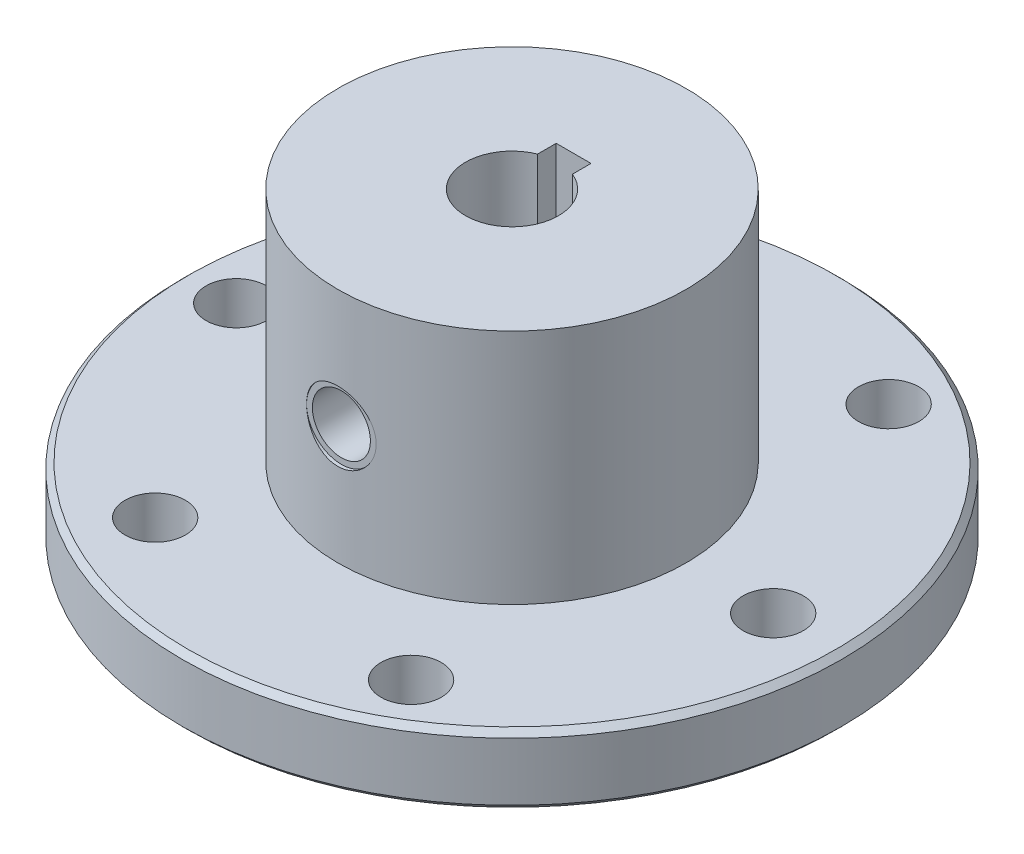
ISO-10303-21;
HEADER;
FILE_DESCRIPTION(('STEP AP214'),'2;1');
FILE_NAME('part.step','',(''),(''),'','','');
FILE_SCHEMA(('AUTOMOTIVE_DESIGN { 1 0 10303 214 1 1 1 1 }'));
ENDSEC;
DATA;
#1=APPLICATION_CONTEXT('core data for automotive mechanical design processes');
#2=APPLICATION_PROTOCOL_DEFINITION('international standard','automotive_design',2000,#1);
#3=PRODUCT_CONTEXT('',#1,'mechanical');
#4=PRODUCT('Part','Part','',(#3));
#5=PRODUCT_RELATED_PRODUCT_CATEGORY('part','',(#4));
#6=PRODUCT_DEFINITION_FORMATION('','',#4);
#7=PRODUCT_DEFINITION_CONTEXT('part definition',#1,'design');
#8=PRODUCT_DEFINITION('design','',#6,#7);
#9=PRODUCT_DEFINITION_SHAPE('','',#8);
#10=(LENGTH_UNIT() NAMED_UNIT(*) SI_UNIT(.MILLI.,.METRE.));
#11=(NAMED_UNIT(*) PLANE_ANGLE_UNIT() SI_UNIT($,.RADIAN.));
#12=(NAMED_UNIT(*) SI_UNIT($,.STERADIAN.) SOLID_ANGLE_UNIT());
#13=UNCERTAINTY_MEASURE_WITH_UNIT(LENGTH_MEASURE(1.E-05),#10,'distance_accuracy_value','');
#14=(GEOMETRIC_REPRESENTATION_CONTEXT(3) GLOBAL_UNCERTAINTY_ASSIGNED_CONTEXT((#13)) GLOBAL_UNIT_ASSIGNED_CONTEXT((#10,
#11,#12)) REPRESENTATION_CONTEXT('',''));
#15=CARTESIAN_POINT('',(0.,0.,0.));
#16=DIRECTION('',(0.,0.,1.));
#17=DIRECTION('',(1.,0.,0.));
#18=AXIS2_PLACEMENT_3D('',#15,#16,#17);
#19=CARTESIAN_POINT('',(0.,26.4,0.));
#20=DIRECTION('',(0.,1.,0.));
#21=DIRECTION('',(0.,0.,1.));
#22=AXIS2_PLACEMENT_3D('',#19,#20,#21);
#23=PLANE('',#22);
#24=CARTESIAN_POINT('',(0.,26.4,0.));
#25=DIRECTION('',(0.,1.,0.));
#26=DIRECTION('',(0.,0.,1.));
#27=AXIS2_PLACEMENT_3D('',#24,#25,#26);
#28=CIRCLE('',#27,4.);
#29=CARTESIAN_POINT('',(-1.49999999999657,26.4,-3.70809924354644));
#30=VERTEX_POINT('',#29);
#31=CARTESIAN_POINT('',(1.50000000000343,26.4,-3.70809924354644));
#32=VERTEX_POINT('',#31);
#33=EDGE_CURVE('E211',#30,#32,#28,.T.);
#34=ORIENTED_EDGE('',*,*,#33,.F.);
#35=DIRECTION('',(0.,0.,-1.));
#36=VECTOR('',#35,1.);
#37=CARTESIAN_POINT('',(-1.49999999999657,26.4,0.));
#38=LINE('',#37,#36);
#39=CARTESIAN_POINT('',(-1.49999999999657,26.4,-5.30809924354644));
#40=VERTEX_POINT('',#39);
#41=EDGE_CURVE('E271',#30,#40,#38,.T.);
#42=ORIENTED_EDGE('',*,*,#41,.T.);
#43=DIRECTION('',(1.,0.,0.));
#44=VECTOR('',#43,1.);
#45=CARTESIAN_POINT('',(0.,26.4,-5.30809924354644));
#46=LINE('',#45,#44);
#47=CARTESIAN_POINT('',(1.50000000000343,26.4,-5.30809924354644));
#48=VERTEX_POINT('',#47);
#49=EDGE_CURVE('E101',#40,#48,#46,.T.);
#50=ORIENTED_EDGE('',*,*,#49,.T.);
#51=DIRECTION('',(0.,0.,1.));
#52=VECTOR('',#51,1.);
#53=CARTESIAN_POINT('',(1.50000000000343,26.4,0.));
#54=LINE('',#53,#52);
#55=EDGE_CURVE('E273',#48,#32,#54,.T.);
#56=ORIENTED_EDGE('',*,*,#55,.T.);
#57=EDGE_LOOP('',(#34,#42,#50,#56));
#58=FACE_BOUND('',#57,.T.);
#59=CARTESIAN_POINT('',(0.,26.4,0.));
#60=DIRECTION('',(0.,1.,0.));
#61=DIRECTION('',(0.,0.,1.));
#62=AXIS2_PLACEMENT_3D('',#59,#60,#61);
#63=CIRCLE('',#62,15.);
#64=CARTESIAN_POINT('',(0.,26.4,15.));
#65=VERTEX_POINT('',#64);
#66=EDGE_CURVE('E214',#65,#65,#63,.T.);
#67=ORIENTED_EDGE('',*,*,#66,.T.);
#68=EDGE_LOOP('',(#67));
#69=FACE_BOUND('',#68,.T.);
#70=ADVANCED_FACE('F43',(#58,#69),#23,.T.);
#71=CARTESIAN_POINT('',(0.,26.4,0.));
#72=DIRECTION('',(0.,-1.,0.));
#73=DIRECTION('',(0.,0.,-1.));
#74=AXIS2_PLACEMENT_3D('',#71,#72,#73);
#75=CYLINDRICAL_SURFACE('',#74,15.);
#76=CARTESIAN_POINT('',(3.,16.2,14.6969384566991));
#77=CARTESIAN_POINT('',(3.00000906327289,16.1165231914215,14.6969312244577));
#78=CARTESIAN_POINT('',(2.99651591463671,16.0330513897383,14.6976495056175));
#79=CARTESIAN_POINT('',(2.98259549441824,15.8667219000309,14.7004835434339));
#80=CARTESIAN_POINT('',(2.97216908062491,15.7838641373195,14.7025991272148));
#81=CARTESIAN_POINT('',(2.94447346178657,15.6194709040173,14.708170006848));
#82=CARTESIAN_POINT('',(2.92721468106147,15.5379336151037,14.7116232616092));
#83=CARTESIAN_POINT('',(2.88600721568467,15.3766535872965,14.7197622168639));
#84=CARTESIAN_POINT('',(2.86205850372287,15.2969108557303,14.7244479223887));
#85=CARTESIAN_POINT('',(2.78041527952091,15.061194294385,14.7401631005323));
#86=CARTESIAN_POINT('',(2.71290158046862,14.9086019420435,14.7528553636172));
#87=CARTESIAN_POINT('',(2.55375565119918,14.6169726172537,14.7812320879208));
#88=CARTESIAN_POINT('',(2.46212092124304,14.4779370517862,14.7969168592162));
#89=CARTESIAN_POINT('',(2.25594334606255,14.2153294220437,14.829758124629));
#90=CARTESIAN_POINT('',(2.14112719277709,14.091973547517,14.8469306312349));
#91=CARTESIAN_POINT('',(1.89243128558791,13.8661342875616,14.8806728038384));
#92=CARTESIAN_POINT('',(1.75854858340981,13.7636541361286,14.8972423761055));
#93=CARTESIAN_POINT('',(1.47408029245692,13.5816339470137,14.9280843032166));
#94=CARTESIAN_POINT('',(1.3233595097447,13.5023012663831,14.9423354158867));
#95=CARTESIAN_POINT('',(1.01040357091221,13.3701721723564,14.9667526662081));
#96=CARTESIAN_POINT('',(0.848170122016175,13.3173718337991,14.9769194080515));
#97=CARTESIAN_POINT('',(0.519052235967757,13.2404789003166,14.9919095326336));
#98=CARTESIAN_POINT('',(0.352257106220374,13.2160176437936,14.996801475465));
#99=CARTESIAN_POINT('',(0.0168596277551948,13.1953470494404,15.0009276525647));
#100=CARTESIAN_POINT('',(-0.151742587839112,13.1991356446056,15.0001623007697));
#101=CARTESIAN_POINT('',(-0.483426607616182,13.2345786043274,14.9931130332671));
#102=CARTESIAN_POINT('',(-0.646552839896437,13.2658351505753,14.9869079049386));
#103=CARTESIAN_POINT('',(-0.965196019837505,13.3546955300671,14.9697652350655));
#104=CARTESIAN_POINT('',(-1.12071271847092,13.4123002249353,14.9588275387594));
#105=CARTESIAN_POINT('',(-1.42086081389148,13.5525912107189,14.9333186736123));
#106=CARTESIAN_POINT('',(-1.56541718043671,13.6354337608403,14.918724971732));
#107=CARTESIAN_POINT('',(-1.83871931366189,13.8237308107676,14.8875135488761));
#108=CARTESIAN_POINT('',(-1.96746376866397,13.9291871845144,14.8708956602115));
#109=CARTESIAN_POINT('',(-2.20783861961223,14.1618850848928,14.8371311210549));
#110=CARTESIAN_POINT('',(-2.31913408498718,14.2894722062193,14.8199802972521));
#111=CARTESIAN_POINT('',(-2.51883269969927,14.5617142754621,14.7873511834928));
#112=CARTESIAN_POINT('',(-2.60722950726484,14.7063739354975,14.7718733575622));
#113=CARTESIAN_POINT('',(-2.75873986393405,15.009157214839,14.7443319012696));
#114=CARTESIAN_POINT('',(-2.82178462990343,15.16731607019,14.7322775849504));
#115=CARTESIAN_POINT('',(-2.9202212919898,15.4921758937667,14.7130848318748));
#116=CARTESIAN_POINT('',(-2.95565438245299,15.6588637399443,14.7059390738486));
#117=CARTESIAN_POINT('',(-2.98449881436589,15.8890704505393,14.7000953157589));
#118=CARTESIAN_POINT('',(-2.99031376696653,15.9511624193473,14.6989127961598));
#119=CARTESIAN_POINT('',(-2.99805949399395,16.0754935924123,14.6973350216032));
#120=CARTESIAN_POINT('',(-2.99999676871396,16.1377323748673,14.6969384491447));
#121=CARTESIAN_POINT('',(-3.,16.2,14.6969384566991));
#122=B_SPLINE_CURVE_WITH_KNOTS('',3,(#76,#77,#78,#79,#80,#81,#82,#83,#84,#85,#86,#87,#88,#89,
#90,#91,#92,#93,#94,#95,#96,#97,#98,#99,#100,#101,#102,#103,#104,#105,#106,#107,#108,#109,#110,
#111,#112,#113,#114,#115,#116,#117,#118,#119,#120,#121),.UNSPECIFIED.,.F.,.F.,(4,2,2,2,2,2,2,2,
2,2,2,2,2,2,2,2,2,2,2,2,2,2,4),(0.,0.250345531073761,0.500660094964601,0.750594210284372,
1.00052934591733,1.5000082936227,1.99953902430944,2.50534477833307,3.01122883056535,
3.52151451068939,4.03172467755666,4.53522025544509,5.03867899358442,5.53496413269304,
6.03126550223829,6.53070440104676,7.03018470288858,7.53831354930086,8.04658297164637,
8.55622223384239,9.06509969273805,9.25212746067475,9.43884144366995),.UNSPECIFIED.);
#123=CARTESIAN_POINT('',(3.,16.2,14.6969384566991));
#124=VERTEX_POINT('',#123);
#125=CARTESIAN_POINT('',(-3.,16.2,14.6969384566991));
#126=VERTEX_POINT('',#125);
#127=EDGE_CURVE('E94',#124,#126,#122,.T.);
#128=ORIENTED_EDGE('',*,*,#127,.T.);
#129=CARTESIAN_POINT('',(-3.,16.2,14.6969384566991));
#130=CARTESIAN_POINT('',(-3.00000906327289,16.2834768085785,14.6969312244577));
#131=CARTESIAN_POINT('',(-2.99651591463671,16.3669486102617,14.6976495056175));
#132=CARTESIAN_POINT('',(-2.98259549441824,16.5332780999691,14.7004835434339));
#133=CARTESIAN_POINT('',(-2.97216908062491,16.6161358626805,14.7025991272148));
#134=CARTESIAN_POINT('',(-2.94447346178657,16.7805290959827,14.708170006848));
#135=CARTESIAN_POINT('',(-2.92721468106147,16.8620663848963,14.7116232616092));
#136=CARTESIAN_POINT('',(-2.88600721568467,17.0233464127035,14.7197622168639));
#137=CARTESIAN_POINT('',(-2.86205850372287,17.1030891442697,14.7244479223887));
#138=CARTESIAN_POINT('',(-2.7804152795209,17.338805705615,14.7401631005323));
#139=CARTESIAN_POINT('',(-2.71290158046861,17.4913980579565,14.7528553636172));
#140=CARTESIAN_POINT('',(-2.55375565119917,17.7830273827463,14.7812320879208));
#141=CARTESIAN_POINT('',(-2.46212092124303,17.9220629482138,14.7969168592162));
#142=CARTESIAN_POINT('',(-2.25594334606255,18.1846705779563,14.829758124629));
#143=CARTESIAN_POINT('',(-2.14112719277708,18.308026452483,14.8469306312349));
#144=CARTESIAN_POINT('',(-1.89243128558791,18.5338657124384,14.8806728038384));
#145=CARTESIAN_POINT('',(-1.75854858340981,18.6363458638714,14.8972423761055));
#146=CARTESIAN_POINT('',(-1.47408029245692,18.8183660529863,14.9280843032166));
#147=CARTESIAN_POINT('',(-1.3233595097447,18.8976987336169,14.9423354158867));
#148=CARTESIAN_POINT('',(-1.0104035709122,19.0298278276436,14.9667526662081));
#149=CARTESIAN_POINT('',(-0.848170122016169,19.0826281662009,14.9769194080515));
#150=CARTESIAN_POINT('',(-0.51905223596775,19.1595210996834,14.9919095326336));
#151=CARTESIAN_POINT('',(-0.352257106220367,19.1839823562064,14.996801475465));
#152=CARTESIAN_POINT('',(-0.0168596277551882,19.2046529505596,15.0009276525647));
#153=CARTESIAN_POINT('',(0.151742587839119,19.2008643553944,15.0001623007697));
#154=CARTESIAN_POINT('',(0.483426607616188,19.1654213956726,14.9931130332671));
#155=CARTESIAN_POINT('',(0.646552839896443,19.1341648494247,14.9869079049386));
#156=CARTESIAN_POINT('',(0.965196019837511,19.0453044699329,14.9697652350655));
#157=CARTESIAN_POINT('',(1.12071271847092,18.9876997750647,14.9588275387594));
#158=CARTESIAN_POINT('',(1.42086081389149,18.8474087892811,14.9333186736123));
#159=CARTESIAN_POINT('',(1.56541718043671,18.7645662391597,14.918724971732));
#160=CARTESIAN_POINT('',(1.83871931366189,18.5762691892324,14.8875135488761));
#161=CARTESIAN_POINT('',(1.96746376866398,18.4708128154856,14.8708956602115));
#162=CARTESIAN_POINT('',(2.20783861961224,18.2381149151072,14.8371311210549));
#163=CARTESIAN_POINT('',(2.31913408498719,18.1105277937807,14.8199802972521));
#164=CARTESIAN_POINT('',(2.51883269969928,17.8382857245379,14.7873511834928));
#165=CARTESIAN_POINT('',(2.60722950726484,17.6936260645025,14.7718733575622));
#166=CARTESIAN_POINT('',(2.75873986393405,17.390842785161,14.7443319012696));
#167=CARTESIAN_POINT('',(2.82178462990344,17.2326839298099,14.7322775849504));
#168=CARTESIAN_POINT('',(2.9202212919898,16.9078241062333,14.7130848318748));
#169=CARTESIAN_POINT('',(2.95565438245299,16.7411362600556,14.7059390738486));
#170=CARTESIAN_POINT('',(2.9844988143659,16.5109295494607,14.7000953157589));
#171=CARTESIAN_POINT('',(2.99031376696653,16.4488375806527,14.6989127961598));
#172=CARTESIAN_POINT('',(2.99805949399395,16.3245064075877,14.6973350216032));
#173=CARTESIAN_POINT('',(2.99999676871397,16.2622676251327,14.6969384491447));
#174=CARTESIAN_POINT('',(3.,16.2,14.6969384566991));
#175=B_SPLINE_CURVE_WITH_KNOTS('',3,(#129,#130,#131,#132,#133,#134,#135,#136,#137,#138,#139,
#140,#141,#142,#143,#144,#145,#146,#147,#148,#149,#150,#151,#152,#153,#154,#155,#156,#157,#158,
#159,#160,#161,#162,#163,#164,#165,#166,#167,#168,#169,#170,#171,#172,#173,#174),.UNSPECIFIED.,
.F.,.F.,(4,2,2,2,2,2,2,2,2,2,2,2,2,2,2,2,2,2,2,2,2,2,4),(0.,0.250345531073761,0.500660094964601,
0.750594210284374,1.00052934591733,1.5000082936227,1.99953902430944,2.50534477833307,
3.01122883056535,3.52151451068939,4.03172467755666,4.53522025544509,5.03867899358442,
5.53496413269304,6.03126550223829,6.53070440104676,7.03018470288858,7.53831354930086,
8.04658297164637,8.55622223384239,9.06509969273805,9.25212746067475,9.43884144366994),.UNSPECIFIED.);
#176=EDGE_CURVE('E92',#126,#124,#175,.T.);
#177=ORIENTED_EDGE('',*,*,#176,.T.);
#178=EDGE_LOOP('',(#128,#177));
#179=FACE_BOUND('',#178,.T.);
#180=CARTESIAN_POINT('',(0.,6.,0.));
#181=DIRECTION('',(0.,1.,0.));
#182=DIRECTION('',(0.,0.,1.));
#183=AXIS2_PLACEMENT_3D('',#180,#181,#182);
#184=CIRCLE('',#183,15.);
#185=CARTESIAN_POINT('',(0.,6.,15.));
#186=VERTEX_POINT('',#185);
#187=EDGE_CURVE('E187',#186,#186,#184,.T.);
#188=ORIENTED_EDGE('',*,*,#187,.T.);
#189=EDGE_LOOP('',(#188));
#190=FACE_BOUND('',#189,.T.);
#191=ORIENTED_EDGE('',*,*,#66,.F.);
#192=EDGE_LOOP('',(#191));
#193=FACE_BOUND('',#192,.T.);
#194=ADVANCED_FACE('F97',(#179,#190,#193),#75,.T.);
#195=CARTESIAN_POINT('',(0.,0.,0.));
#196=DIRECTION('',(0.,1.,0.));
#197=DIRECTION('',(0.,0.,1.));
#198=AXIS2_PLACEMENT_3D('',#195,#196,#197);
#199=PLANE('',#198);
#200=CARTESIAN_POINT('',(0.,0.,0.));
#201=DIRECTION('',(0.,1.,0.));
#202=DIRECTION('',(0.,0.,1.));
#203=AXIS2_PLACEMENT_3D('',#200,#201,#202);
#204=CIRCLE('',#203,27.9);
#205=CARTESIAN_POINT('',(0.,0.,27.9));
#206=VERTEX_POINT('',#205);
#207=EDGE_CURVE('E11',#206,#206,#204,.F.);
#208=ORIENTED_EDGE('',*,*,#207,.T.);
#209=EDGE_LOOP('',(#208));
#210=FACE_BOUND('',#209,.T.);
#211=CARTESIAN_POINT('',(11.875,0.,-20.5681033398804));
#212=DIRECTION('',(0.,1.,0.));
#213=DIRECTION('',(0.,0.,1.));
#214=AXIS2_PLACEMENT_3D('',#211,#212,#213);
#215=CIRCLE('',#214,2.6);
#216=CARTESIAN_POINT('',(11.875,0.,-17.9681033398804));
#217=VERTEX_POINT('',#216);
#218=EDGE_CURVE('E222',#217,#217,#215,.F.);
#219=ORIENTED_EDGE('',*,*,#218,.F.);
#220=EDGE_LOOP('',(#219));
#221=FACE_BOUND('',#220,.T.);
#222=CARTESIAN_POINT('',(22.5,0.,0.));
#223=DIRECTION('',(0.,1.,0.));
#224=DIRECTION('',(0.,0.,1.));
#225=AXIS2_PLACEMENT_3D('',#222,#223,#224);
#226=CIRCLE('',#225,2.6);
#227=CARTESIAN_POINT('',(22.5,0.,2.6));
#228=VERTEX_POINT('',#227);
#229=EDGE_CURVE('E228',#228,#228,#226,.F.);
#230=ORIENTED_EDGE('',*,*,#229,.F.);
#231=EDGE_LOOP('',(#230));
#232=FACE_BOUND('',#231,.T.);
#233=CARTESIAN_POINT('',(11.875,0.,20.5681033398804));
#234=DIRECTION('',(0.,1.,0.));
#235=DIRECTION('',(0.,0.,1.));
#236=AXIS2_PLACEMENT_3D('',#233,#234,#235);
#237=CIRCLE('',#236,2.6);
#238=CARTESIAN_POINT('',(11.875,0.,23.1681033398804));
#239=VERTEX_POINT('',#238);
#240=EDGE_CURVE('E249',#239,#239,#237,.F.);
#241=ORIENTED_EDGE('',*,*,#240,.F.);
#242=EDGE_LOOP('',(#241));
#243=FACE_BOUND('',#242,.T.);
#244=CARTESIAN_POINT('',(-11.25,0.,19.4855715851499));
#245=DIRECTION('',(0.,1.,0.));
#246=DIRECTION('',(0.,0.,1.));
#247=AXIS2_PLACEMENT_3D('',#244,#245,#246);
#248=CIRCLE('',#247,2.6);
#249=CARTESIAN_POINT('',(-11.25,0.,22.0855715851499));
#250=VERTEX_POINT('',#249);
#251=EDGE_CURVE('E243',#250,#250,#248,.F.);
#252=ORIENTED_EDGE('',*,*,#251,.F.);
#253=EDGE_LOOP('',(#252));
#254=FACE_BOUND('',#253,.T.);
#255=CARTESIAN_POINT('',(-23.75,0.,0.));
#256=DIRECTION('',(0.,1.,0.));
#257=DIRECTION('',(0.,0.,1.));
#258=AXIS2_PLACEMENT_3D('',#255,#256,#257);
#259=CIRCLE('',#258,2.6);
#260=CARTESIAN_POINT('',(-23.75,0.,2.6));
#261=VERTEX_POINT('',#260);
#262=EDGE_CURVE('E237',#261,#261,#259,.F.);
#263=ORIENTED_EDGE('',*,*,#262,.F.);
#264=EDGE_LOOP('',(#263));
#265=FACE_BOUND('',#264,.T.);
#266=CARTESIAN_POINT('',(-11.25,0.,-19.4855715851499));
#267=DIRECTION('',(0.,1.,0.));
#268=DIRECTION('',(0.,0.,1.));
#269=AXIS2_PLACEMENT_3D('',#266,#267,#268);
#270=CIRCLE('',#269,2.6);
#271=CARTESIAN_POINT('',(-11.25,0.,-16.8855715851499));
#272=VERTEX_POINT('',#271);
#273=EDGE_CURVE('E229',#272,#272,#270,.F.);
#274=ORIENTED_EDGE('',*,*,#273,.F.);
#275=EDGE_LOOP('',(#274));
#276=FACE_BOUND('',#275,.T.);
#277=DIRECTION('',(0.,0.,1.));
#278=VECTOR('',#277,1.);
#279=CARTESIAN_POINT('',(-1.49999999999657,0.,0.));
#280=LINE('',#279,#278);
#281=CARTESIAN_POINT('',(-1.49999999999657,0.,-5.30809924354644));
#282=VERTEX_POINT('',#281);
#283=CARTESIAN_POINT('',(-1.49999999999657,0.,-3.70809924354644));
#284=VERTEX_POINT('',#283);
#285=EDGE_CURVE('E259',#282,#284,#280,.T.);
#286=ORIENTED_EDGE('',*,*,#285,.T.);
#287=CARTESIAN_POINT('',(0.,0.,0.));
#288=DIRECTION('',(0.,1.,0.));
#289=DIRECTION('',(0.,0.,1.));
#290=AXIS2_PLACEMENT_3D('',#287,#288,#289);
#291=CIRCLE('',#290,4.);
#292=CARTESIAN_POINT('',(1.50000000000343,0.,-3.70809924354644));
#293=VERTEX_POINT('',#292);
#294=EDGE_CURVE('E217',#284,#293,#291,.T.);
#295=ORIENTED_EDGE('',*,*,#294,.T.);
#296=DIRECTION('',(0.,0.,-1.));
#297=VECTOR('',#296,1.);
#298=CARTESIAN_POINT('',(1.50000000000343,0.,0.));
#299=LINE('',#298,#297);
#300=CARTESIAN_POINT('',(1.50000000000343,0.,-5.30809924354644));
#301=VERTEX_POINT('',#300);
#302=EDGE_CURVE('E66',#293,#301,#299,.T.);
#303=ORIENTED_EDGE('',*,*,#302,.T.);
#304=DIRECTION('',(-1.,0.,0.));
#305=VECTOR('',#304,1.);
#306=CARTESIAN_POINT('',(0.,0.,-5.30809924354644));
#307=LINE('',#306,#305);
#308=EDGE_CURVE('E236',#301,#282,#307,.T.);
#309=ORIENTED_EDGE('',*,*,#308,.T.);
#310=EDGE_LOOP('',(#286,#295,#303,#309));
#311=FACE_BOUND('',#310,.T.);
#312=ADVANCED_FACE('F125',(#210,#221,#232,#243,#254,#265,#276,#311),#199,.F.);
#313=CARTESIAN_POINT('',(0.,37.7137084989848,0.));
#314=DIRECTION('',(0.,-1.,0.));
#315=DIRECTION('',(0.,0.,-1.));
#316=AXIS2_PLACEMENT_3D('',#313,#314,#315);
#317=CYLINDRICAL_SURFACE('',#316,4.);
#318=CARTESIAN_POINT('',(2.49999999999999,16.2,3.1224989991992));
#319=CARTESIAN_POINT('',(2.49999941097138,16.1378432485545,3.12249991555421));
#320=CARTESIAN_POINT('',(2.49767581942172,16.0756740533292,3.12436490733917));
#321=CARTESIAN_POINT('',(2.48843349840856,15.9518828204523,3.13172923119027));
#322=CARTESIAN_POINT('',(2.48151206248432,15.8902611267429,3.13723070381365));
#323=CARTESIAN_POINT('',(2.45397595058364,15.7067739522563,3.15888953558505));
#324=CARTESIAN_POINT('',(2.42658990946458,15.586451668811,3.18020036271143));
#325=CARTESIAN_POINT('',(2.35576217141197,15.3544018021218,3.23299770760368));
#326=CARTESIAN_POINT('',(2.31245961359201,15.2426095849449,3.2643957538321));
#327=CARTESIAN_POINT('',(2.21143916430898,15.0279914746659,3.3336600088444));
#328=CARTESIAN_POINT('',(2.15372087963016,14.9251658262469,3.37152639405535));
#329=CARTESIAN_POINT('',(2.01647682425577,14.7162660186963,3.45559225121876));
#330=CARTESIAN_POINT('',(1.93506425666948,14.6116066749955,3.50222814511578));
#331=CARTESIAN_POINT('',(1.75662526657431,14.4162384483762,3.59505503533368));
#332=CARTESIAN_POINT('',(1.65958538899781,14.3255417200464,3.64124561158438));
#333=CARTESIAN_POINT('',(1.43833990582853,14.1497797018273,3.73459524771314));
#334=CARTESIAN_POINT('',(1.31226934259651,14.0667138155496,3.78119887781505));
#335=CARTESIAN_POINT('',(1.11163395543429,13.9594548452638,3.84307251838774));
#336=CARTESIAN_POINT('',(1.04281240974104,13.9265848616669,3.86236283092052));
#337=CARTESIAN_POINT('',(0.901758767615549,13.8670453146367,3.89770436975436));
#338=CARTESIAN_POINT('',(0.829529068393797,13.8403714689616,3.91375783207118));
#339=CARTESIAN_POINT('',(0.689700297916577,13.7960161847437,3.94066759113823));
#340=CARTESIAN_POINT('',(0.62237198127859,13.7776980234819,3.95188535984466));
#341=CARTESIAN_POINT('',(0.48599757589881,13.7466977136867,3.97096241909162));
#342=CARTESIAN_POINT('',(0.416952503441684,13.7340123107838,3.97882364879721));
#343=CARTESIAN_POINT('',(0.277765449857176,13.7144862023655,3.99095470334737));
#344=CARTESIAN_POINT('',(0.207624174243908,13.7076418834866,3.99522674847834));
#345=CARTESIAN_POINT('',(0.0669114466599417,13.6999007866108,4.00006125072438));
#346=CARTESIAN_POINT('',(-0.00365995486027597,13.6990033240367,4.00062413482248));
#347=CARTESIAN_POINT('',(-0.196045081555535,13.7047253735473,3.99704479619503));
#348=CARTESIAN_POINT('',(-0.317681845488532,13.7173065030789,3.98917040897436));
#349=CARTESIAN_POINT('',(-0.556636494620251,13.7597302179661,3.96290903275931));
#350=CARTESIAN_POINT('',(-0.673954052677421,13.7895741079736,3.94452124920478));
#351=CARTESIAN_POINT('',(-0.901771991763861,13.8652085592833,3.89876170711609));
#352=CARTESIAN_POINT('',(-1.01225407159606,13.9110399195711,3.87136697381047));
#353=CARTESIAN_POINT('',(-1.22404012071222,14.0169372389843,3.80971291751354));
#354=CARTESIAN_POINT('',(-1.32534199174244,14.0770064410637,3.77545203089318));
#355=CARTESIAN_POINT('',(-1.52942649744658,14.2180564169237,3.69786441247167));
#356=CARTESIAN_POINT('',(-1.63082454612906,14.3007092766905,3.65394006381521));
#357=CARTESIAN_POINT('',(-1.81919733573062,14.4802647372071,3.56390927740507));
#358=CARTESIAN_POINT('',(-1.90615071842623,14.577188046384,3.5177997357041));
#359=CARTESIAN_POINT('',(-2.07470887167908,14.7974112531735,3.42142883464467));
#360=CARTESIAN_POINT('',(-2.15413229677843,14.9225027633581,3.37141162686597));
#361=CARTESIAN_POINT('',(-2.29052307550562,15.1872922373014,3.28028278192383));
#362=CARTESIAN_POINT('',(-2.34753179448503,15.3269626874531,3.23915480386932));
#363=CARTESIAN_POINT('',(-2.4243713352793,15.5795388061062,3.18183753131764));
#364=CARTESIAN_POINT('',(-2.45003683445403,15.6898219252135,3.16193408602514));
#365=CARTESIAN_POINT('',(-2.4862033707309,15.9142303775599,3.13358277759548));
#366=CARTESIAN_POINT('',(-2.4967251252081,16.0283502426568,3.1251192650444));
#367=CARTESIAN_POINT('',(-2.50197072095179,16.2574573605024,3.12092267030678));
#368=CARTESIAN_POINT('',(-2.49665835896693,16.3724460004785,3.12521876170186));
#369=CARTESIAN_POINT('',(-2.47051466367813,16.5995611643185,3.14592085836189));
#370=CARTESIAN_POINT('',(-2.44967047849125,16.7116852383712,3.16233689222907));
#371=CARTESIAN_POINT('',(-2.39409874195036,16.9284367594257,3.20460120797144));
#372=CARTESIAN_POINT('',(-2.35960571424756,17.0331573158943,3.23028954367818));
#373=CARTESIAN_POINT('',(-2.27804893702241,17.2355746998938,3.2883114838875));
#374=CARTESIAN_POINT('',(-2.23098072583745,17.333269018878,3.32064744602082));
#375=CARTESIAN_POINT('',(-2.11530798730692,17.5386119416632,3.39574401285204));
#376=CARTESIAN_POINT('',(-2.04430931160542,17.6446145273018,3.43931724293016));
#377=CARTESIAN_POINT('',(-1.88737868921487,17.8443706606543,3.52787943213339));
#378=CARTESIAN_POINT('',(-1.80143124902617,17.9381113212423,3.57286982004468));
#379=CARTESIAN_POINT('',(-1.60076932492118,18.125964070641,3.66766209459506));
#380=CARTESIAN_POINT('',(-1.48365201617174,18.2177273984849,3.71707933883202));
#381=CARTESIAN_POINT('',(-1.23256787407807,18.3801470147197,3.80768973398607));
#382=CARTESIAN_POINT('',(-1.09860897940971,18.4508131951269,3.8488867361901));
#383=CARTESIAN_POINT('',(-0.891930804655058,18.536581067975,3.89988966499777));
#384=CARTESIAN_POINT('',(-0.824318196039397,18.5612974439513,3.91477055097246));
#385=CARTESIAN_POINT('',(-0.686640792876401,18.6049382767323,3.94124643918619));
#386=CARTESIAN_POINT('',(-0.616577444051113,18.6238660861509,3.95284334314805));
#387=CARTESIAN_POINT('',(-0.474639231464242,18.6556058301392,3.9723851203995));
#388=CARTESIAN_POINT('',(-0.402766005755487,18.6684230995164,3.98033317908836));
#389=CARTESIAN_POINT('',(-0.257881807142442,18.6877391722929,3.99234168343343));
#390=CARTESIAN_POINT('',(-0.184871024482516,18.6942390209308,3.99640277220024));
#391=CARTESIAN_POINT('',(0.0131102774249097,18.7030715155071,4.00191521492706));
#392=CARTESIAN_POINT('',(0.138539079205466,18.6992657929094,3.99952706123947));
#393=CARTESIAN_POINT('',(0.386583137102146,18.6730824104545,3.98321975018362));
#394=CARTESIAN_POINT('',(0.509198520626844,18.6507055933212,3.96930111604857));
#395=CARTESIAN_POINT('',(0.744080605483861,18.5896775844539,3.93192083384285));
#396=CARTESIAN_POINT('',(0.856558752631823,18.5516179264353,3.90880701054803));
#397=CARTESIAN_POINT('',(1.07343034721919,18.4608805375565,3.85489971248843));
#398=CARTESIAN_POINT('',(1.17782242685803,18.4082003404328,3.82410494215308));
#399=CARTESIAN_POINT('',(1.38731297754798,18.28367872128,3.75350673935648));
#400=CARTESIAN_POINT('',(1.4913601218378,18.2104160092425,3.71310001864657));
#401=CARTESIAN_POINT('',(1.68643334934803,18.0498467674859,3.62867283985205));
#402=CARTESIAN_POINT('',(1.77744451843681,17.9625243911657,3.58464833191203));
#403=CARTESIAN_POINT('',(1.95744716561589,17.7617674849381,3.49000828219718));
#404=CARTESIAN_POINT('',(2.04425661250064,17.6463833874286,3.43935738427104));
#405=CARTESIAN_POINT('',(2.19754648509904,17.4007105902402,3.34349647457112));
#406=CARTESIAN_POINT('',(2.26403815415027,17.2704301888475,3.2982834620419));
#407=CARTESIAN_POINT('',(2.3619822941284,17.0271946992151,3.22859539780091));
#408=CARTESIAN_POINT('',(2.39792458576829,16.9167294278464,3.2017463933877));
#409=CARTESIAN_POINT('',(2.45425618419745,16.6900606569982,3.1587835810451));
#410=CARTESIAN_POINT('',(2.47469472410167,16.5738765802003,3.14263581150429));
#411=CARTESIAN_POINT('',(2.49119847139521,16.4139400053539,3.12952857640608));
#412=CARTESIAN_POINT('',(2.49449433837959,16.3712744742913,3.12689994306771));
#413=CARTESIAN_POINT('',(2.49889558125806,16.2857413010482,3.12338461939863));
#414=CARTESIAN_POINT('',(2.50000040629187,16.2428736107566,3.12249836712872));
#415=CARTESIAN_POINT('',(2.49999999999999,16.2,3.1224989991992));
#416=B_SPLINE_CURVE_WITH_KNOTS('',3,(#318,#319,#320,#321,#322,#323,#324,#325,#326,#327,#328,
#329,#330,#331,#332,#333,#334,#335,#336,#337,#338,#339,#340,#341,#342,#343,#344,#345,#346,#347,
#348,#349,#350,#351,#352,#353,#354,#355,#356,#357,#358,#359,#360,#361,#362,#363,#364,#365,#366,
#367,#368,#369,#370,#371,#372,#373,#374,#375,#376,#377,#378,#379,#380,#381,#382,#383,#384,#385,
#386,#387,#388,#389,#390,#391,#392,#393,#394,#395,#396,#397,#398,#399,#400,#401,#402,#403,#404,
#405,#406,#407,#408,#409,#410,#411,#412,#413,#414,#415),.UNSPECIFIED.,.T.,.F.,(4,2,2,2,2,2,2,2,
2,2,2,2,2,2,2,2,2,2,2,2,2,2,2,2,2,2,2,2,2,2,2,2,2,2,2,2,2,2,2,2,2,2,2,2,2,2,2,2,4),(0.,
0.186415315858463,0.372940459994494,0.746478880764684,1.11682668423132,1.48718459072604,
1.9072279868507,2.32763499192878,2.79876029265968,3.03445880867312,3.26999394209507,
3.48170145743203,3.69328649746502,3.90474055342593,4.11617026725865,4.48184709708112,
4.84755156693917,5.21419620193002,5.58092442797432,5.99329080205305,6.40626158573462,
6.87316206383502,7.33919680735483,7.68265621505462,8.02564530559505,8.36941921026404,
8.71347788865087,9.05186495232122,9.39037223519196,9.79332737765184,10.1967026751544,
10.6647326786671,11.1325428866818,11.3527929661038,11.5729152387446,11.7928449800803,
12.0127383271001,12.3871595324234,12.7615637480925,13.1229788842093,13.4844550226785,
13.8834503840958,14.2828986410982,14.7399238503459,15.1966956936286,15.5530255473291,
15.9082190611886,16.0367696833384,16.1653526209167),.UNSPECIFIED.);
#417=CARTESIAN_POINT('',(2.49999999999999,16.2,3.1224989991992));
#418=VERTEX_POINT('',#417);
#419=EDGE_CURVE('E106',#418,#418,#416,.T.);
#420=ORIENTED_EDGE('',*,*,#419,.F.);
#421=EDGE_LOOP('',(#420));
#422=FACE_BOUND('',#421,.T.);
#423=ORIENTED_EDGE('',*,*,#294,.F.);
#424=DIRECTION('',(0.,1.,0.));
#425=VECTOR('',#424,1.);
#426=CARTESIAN_POINT('',(-1.49999999999657,-3.4,-3.70809924354644));
#427=LINE('',#426,#425);
#428=EDGE_CURVE('E266',#284,#30,#427,.T.);
#429=ORIENTED_EDGE('',*,*,#428,.T.);
#430=ORIENTED_EDGE('',*,*,#33,.T.);
#431=DIRECTION('',(0.,1.,0.));
#432=VECTOR('',#431,1.);
#433=CARTESIAN_POINT('',(1.50000000000343,-3.4,-3.70809924354644));
#434=LINE('',#433,#432);
#435=EDGE_CURVE('E264',#293,#32,#434,.T.);
#436=ORIENTED_EDGE('',*,*,#435,.F.);
#437=EDGE_LOOP('',(#423,#429,#430,#436));
#438=FACE_BOUND('',#437,.T.);
#439=ADVANCED_FACE('F175',(#422,#438),#317,.F.);
#440=CARTESIAN_POINT('',(0.,6.,0.));
#441=DIRECTION('',(0.,-1.,0.));
#442=DIRECTION('',(0.,0.,-1.));
#443=AXIS2_PLACEMENT_3D('',#440,#441,#442);
#444=CYLINDRICAL_SURFACE('',#443,28.4);
#445=CARTESIAN_POINT('',(0.,5.5,0.));
#446=DIRECTION('',(0.,1.,0.));
#447=DIRECTION('',(0.,0.,1.));
#448=AXIS2_PLACEMENT_3D('',#445,#446,#447);
#449=CIRCLE('',#448,28.4);
#450=CARTESIAN_POINT('',(0.,5.5,28.4));
#451=VERTEX_POINT('',#450);
#452=EDGE_CURVE('E52',#451,#451,#449,.F.);
#453=ORIENTED_EDGE('',*,*,#452,.T.);
#454=EDGE_LOOP('',(#453));
#455=FACE_BOUND('',#454,.T.);
#456=CARTESIAN_POINT('',(0.,0.500000000000007,0.));
#457=DIRECTION('',(0.,1.,0.));
#458=DIRECTION('',(0.,0.,1.));
#459=AXIS2_PLACEMENT_3D('',#456,#457,#458);
#460=CIRCLE('',#459,28.4);
#461=CARTESIAN_POINT('',(0.,0.500000000000007,28.4));
#462=VERTEX_POINT('',#461);
#463=EDGE_CURVE('E306',#462,#462,#460,.T.);
#464=ORIENTED_EDGE('',*,*,#463,.T.);
#465=EDGE_LOOP('',(#464));
#466=FACE_BOUND('',#465,.T.);
#467=ADVANCED_FACE('F178',(#455,#466),#444,.T.);
#468=CARTESIAN_POINT('',(0.,6.,0.));
#469=DIRECTION('',(0.,1.,0.));
#470=DIRECTION('',(0.,0.,1.));
#471=AXIS2_PLACEMENT_3D('',#468,#469,#470);
#472=PLANE('',#471);
#473=CARTESIAN_POINT('',(0.,6.,0.));
#474=DIRECTION('',(0.,1.,0.));
#475=DIRECTION('',(0.,0.,1.));
#476=AXIS2_PLACEMENT_3D('',#473,#474,#475);
#477=CIRCLE('',#476,27.9);
#478=CARTESIAN_POINT('',(0.,6.,27.9));
#479=VERTEX_POINT('',#478);
#480=EDGE_CURVE('E189',#479,#479,#477,.T.);
#481=ORIENTED_EDGE('',*,*,#480,.T.);
#482=EDGE_LOOP('',(#481));
#483=FACE_BOUND('',#482,.T.);
#484=CARTESIAN_POINT('',(-11.25,6.,-19.4855715851499));
#485=DIRECTION('',(0.,1.,0.));
#486=DIRECTION('',(0.,0.,1.));
#487=AXIS2_PLACEMENT_3D('',#484,#485,#486);
#488=CIRCLE('',#487,2.6);
#489=CARTESIAN_POINT('',(-11.25,6.,-16.8855715851499));
#490=VERTEX_POINT('',#489);
#491=EDGE_CURVE('E233',#490,#490,#488,.T.);
#492=ORIENTED_EDGE('',*,*,#491,.F.);
#493=EDGE_LOOP('',(#492));
#494=FACE_BOUND('',#493,.T.);
#495=CARTESIAN_POINT('',(-23.75,6.,0.));
#496=DIRECTION('',(0.,1.,0.));
#497=DIRECTION('',(0.,0.,1.));
#498=AXIS2_PLACEMENT_3D('',#495,#496,#497);
#499=CIRCLE('',#498,2.6);
#500=CARTESIAN_POINT('',(-23.75,6.,2.6));
#501=VERTEX_POINT('',#500);
#502=EDGE_CURVE('E232',#501,#501,#499,.T.);
#503=ORIENTED_EDGE('',*,*,#502,.F.);
#504=EDGE_LOOP('',(#503));
#505=FACE_BOUND('',#504,.T.);
#506=CARTESIAN_POINT('',(-11.25,6.,19.4855715851499));
#507=DIRECTION('',(0.,1.,0.));
#508=DIRECTION('',(0.,0.,1.));
#509=AXIS2_PLACEMENT_3D('',#506,#507,#508);
#510=CIRCLE('',#509,2.6);
#511=CARTESIAN_POINT('',(-11.25,6.,22.0855715851499));
#512=VERTEX_POINT('',#511);
#513=EDGE_CURVE('E240',#512,#512,#510,.T.);
#514=ORIENTED_EDGE('',*,*,#513,.F.);
#515=EDGE_LOOP('',(#514));
#516=FACE_BOUND('',#515,.T.);
#517=CARTESIAN_POINT('',(11.875,6.,20.5681033398804));
#518=DIRECTION('',(0.,1.,0.));
#519=DIRECTION('',(0.,0.,1.));
#520=AXIS2_PLACEMENT_3D('',#517,#518,#519);
#521=CIRCLE('',#520,2.6);
#522=CARTESIAN_POINT('',(11.875,6.,23.1681033398804));
#523=VERTEX_POINT('',#522);
#524=EDGE_CURVE('E246',#523,#523,#521,.T.);
#525=ORIENTED_EDGE('',*,*,#524,.F.);
#526=EDGE_LOOP('',(#525));
#527=FACE_BOUND('',#526,.T.);
#528=CARTESIAN_POINT('',(22.5,6.,0.));
#529=DIRECTION('',(0.,1.,0.));
#530=DIRECTION('',(0.,0.,1.));
#531=AXIS2_PLACEMENT_3D('',#528,#529,#530);
#532=CIRCLE('',#531,2.6);
#533=CARTESIAN_POINT('',(22.5,6.,2.6));
#534=VERTEX_POINT('',#533);
#535=EDGE_CURVE('E252',#534,#534,#532,.T.);
#536=ORIENTED_EDGE('',*,*,#535,.F.);
#537=EDGE_LOOP('',(#536));
#538=FACE_BOUND('',#537,.T.);
#539=CARTESIAN_POINT('',(11.875,6.,-20.5681033398804));
#540=DIRECTION('',(0.,1.,0.));
#541=DIRECTION('',(0.,0.,1.));
#542=AXIS2_PLACEMENT_3D('',#539,#540,#541);
#543=CIRCLE('',#542,2.6);
#544=CARTESIAN_POINT('',(11.875,6.,-17.9681033398804));
#545=VERTEX_POINT('',#544);
#546=EDGE_CURVE('E225',#545,#545,#543,.T.);
#547=ORIENTED_EDGE('',*,*,#546,.F.);
#548=EDGE_LOOP('',(#547));
#549=FACE_BOUND('',#548,.T.);
#550=ORIENTED_EDGE('',*,*,#187,.F.);
#551=EDGE_LOOP('',(#550));
#552=FACE_BOUND('',#551,.T.);
#553=ADVANCED_FACE('F127',(#483,#494,#505,#516,#527,#538,#549,#552),#472,.T.);
#554=CARTESIAN_POINT('',(11.875,-7.3539105243401,-20.5681033398804));
#555=DIRECTION('',(0.,1.,0.));
#556=DIRECTION('',(0.,0.,1.));
#557=AXIS2_PLACEMENT_3D('',#554,#555,#556);
#558=CYLINDRICAL_SURFACE('',#557,2.6);
#559=ORIENTED_EDGE('',*,*,#218,.T.);
#560=EDGE_LOOP('',(#559));
#561=FACE_BOUND('',#560,.T.);
#562=ORIENTED_EDGE('',*,*,#546,.T.);
#563=EDGE_LOOP('',(#562));
#564=FACE_BOUND('',#563,.T.);
#565=ADVANCED_FACE('F157',(#561,#564),#558,.F.);
#566=CARTESIAN_POINT('',(22.5,-7.3539105243401,0.));
#567=DIRECTION('',(0.,1.,0.));
#568=DIRECTION('',(0.,0.,1.));
#569=AXIS2_PLACEMENT_3D('',#566,#567,#568);
#570=CYLINDRICAL_SURFACE('',#569,2.6);
#571=ORIENTED_EDGE('',*,*,#229,.T.);
#572=EDGE_LOOP('',(#571));
#573=FACE_BOUND('',#572,.T.);
#574=ORIENTED_EDGE('',*,*,#535,.T.);
#575=EDGE_LOOP('',(#574));
#576=FACE_BOUND('',#575,.T.);
#577=ADVANCED_FACE('F153',(#573,#576),#570,.F.);
#578=CARTESIAN_POINT('',(11.875,-7.3539105243401,20.5681033398804));
#579=DIRECTION('',(0.,1.,0.));
#580=DIRECTION('',(0.,0.,1.));
#581=AXIS2_PLACEMENT_3D('',#578,#579,#580);
#582=CYLINDRICAL_SURFACE('',#581,2.6);
#583=ORIENTED_EDGE('',*,*,#240,.T.);
#584=EDGE_LOOP('',(#583));
#585=FACE_BOUND('',#584,.T.);
#586=ORIENTED_EDGE('',*,*,#524,.T.);
#587=EDGE_LOOP('',(#586));
#588=FACE_BOUND('',#587,.T.);
#589=ADVANCED_FACE('F156',(#585,#588),#582,.F.);
#590=CARTESIAN_POINT('',(-11.25,-7.3539105243401,19.4855715851499));
#591=DIRECTION('',(0.,1.,0.));
#592=DIRECTION('',(0.,0.,1.));
#593=AXIS2_PLACEMENT_3D('',#590,#591,#592);
#594=CYLINDRICAL_SURFACE('',#593,2.6);
#595=ORIENTED_EDGE('',*,*,#251,.T.);
#596=EDGE_LOOP('',(#595));
#597=FACE_BOUND('',#596,.T.);
#598=ORIENTED_EDGE('',*,*,#513,.T.);
#599=EDGE_LOOP('',(#598));
#600=FACE_BOUND('',#599,.T.);
#601=ADVANCED_FACE('F161',(#597,#600),#594,.F.);
#602=CARTESIAN_POINT('',(-23.75,-7.3539105243401,0.));
#603=DIRECTION('',(0.,1.,0.));
#604=DIRECTION('',(0.,0.,1.));
#605=AXIS2_PLACEMENT_3D('',#602,#603,#604);
#606=CYLINDRICAL_SURFACE('',#605,2.6);
#607=ORIENTED_EDGE('',*,*,#262,.T.);
#608=EDGE_LOOP('',(#607));
#609=FACE_BOUND('',#608,.T.);
#610=ORIENTED_EDGE('',*,*,#502,.T.);
#611=EDGE_LOOP('',(#610));
#612=FACE_BOUND('',#611,.T.);
#613=ADVANCED_FACE('F165',(#609,#612),#606,.F.);
#614=CARTESIAN_POINT('',(-11.25,-7.3539105243401,-19.4855715851499));
#615=DIRECTION('',(0.,1.,0.));
#616=DIRECTION('',(0.,0.,1.));
#617=AXIS2_PLACEMENT_3D('',#614,#615,#616);
#618=CYLINDRICAL_SURFACE('',#617,2.6);
#619=ORIENTED_EDGE('',*,*,#273,.T.);
#620=EDGE_LOOP('',(#619));
#621=FACE_BOUND('',#620,.T.);
#622=ORIENTED_EDGE('',*,*,#491,.T.);
#623=EDGE_LOOP('',(#622));
#624=FACE_BOUND('',#623,.T.);
#625=ADVANCED_FACE('F146',(#621,#624),#618,.F.);
#626=CARTESIAN_POINT('',(-1.49999999999657,-3.4,0.));
#627=DIRECTION('',(1.,0.,0.));
#628=DIRECTION('',(0.,0.,-1.));
#629=AXIS2_PLACEMENT_3D('',#626,#627,#628);
#630=PLANE('',#629);
#631=DIRECTION('',(0.,1.,0.));
#632=VECTOR('',#631,1.);
#633=CARTESIAN_POINT('',(-1.49999999999657,-3.4,-5.30809924354644));
#634=LINE('',#633,#632);
#635=EDGE_CURVE('E269',#282,#40,#634,.T.);
#636=ORIENTED_EDGE('',*,*,#635,.T.);
#637=ORIENTED_EDGE('',*,*,#41,.F.);
#638=ORIENTED_EDGE('',*,*,#428,.F.);
#639=ORIENTED_EDGE('',*,*,#285,.F.);
#640=EDGE_LOOP('',(#636,#637,#638,#639));
#641=FACE_BOUND('',#640,.T.);
#642=ADVANCED_FACE('F142',(#641),#630,.T.);
#643=CARTESIAN_POINT('',(1.50000000000343,-3.4,0.));
#644=DIRECTION('',(-1.,0.,0.));
#645=DIRECTION('',(0.,0.,1.));
#646=AXIS2_PLACEMENT_3D('',#643,#644,#645);
#647=PLANE('',#646);
#648=ORIENTED_EDGE('',*,*,#435,.T.);
#649=ORIENTED_EDGE('',*,*,#55,.F.);
#650=DIRECTION('',(0.,1.,0.));
#651=VECTOR('',#650,1.);
#652=CARTESIAN_POINT('',(1.50000000000343,-3.4,-5.30809924354644));
#653=LINE('',#652,#651);
#654=EDGE_CURVE('E262',#301,#48,#653,.T.);
#655=ORIENTED_EDGE('',*,*,#654,.F.);
#656=ORIENTED_EDGE('',*,*,#302,.F.);
#657=EDGE_LOOP('',(#648,#649,#655,#656));
#658=FACE_BOUND('',#657,.T.);
#659=ADVANCED_FACE('F145',(#658),#647,.T.);
#660=CARTESIAN_POINT('',(0.,-3.4,-5.30809924354644));
#661=DIRECTION('',(0.,0.,1.));
#662=DIRECTION('',(1.,0.,0.));
#663=AXIS2_PLACEMENT_3D('',#660,#661,#662);
#664=PLANE('',#663);
#665=ORIENTED_EDGE('',*,*,#654,.T.);
#666=ORIENTED_EDGE('',*,*,#49,.F.);
#667=ORIENTED_EDGE('',*,*,#635,.F.);
#668=ORIENTED_EDGE('',*,*,#308,.F.);
#669=EDGE_LOOP('',(#665,#666,#667,#668));
#670=FACE_BOUND('',#669,.T.);
#671=ADVANCED_FACE('F140',(#670),#664,.T.);
#672=CARTESIAN_POINT('',(0.,-0.00764898267434366,14.6969384566991));
#673=DIRECTION('',(0.,0.,1.));
#674=DIRECTION('',(1.,0.,0.));
#675=AXIS2_PLACEMENT_3D('',#672,#673,#674);
#676=PLANE('',#675);
#677=CARTESIAN_POINT('',(0.,16.2,14.6969384566991));
#678=DIRECTION('',(0.,0.,1.));
#679=DIRECTION('',(1.,0.,0.));
#680=AXIS2_PLACEMENT_3D('',#677,#678,#679);
#681=CIRCLE('',#680,2.49999999999999);
#682=CARTESIAN_POINT('',(2.49999999999999,16.2,14.6969384566991));
#683=VERTEX_POINT('',#682);
#684=EDGE_CURVE('E117',#683,#683,#681,.T.);
#685=ORIENTED_EDGE('',*,*,#684,.F.);
#686=EDGE_LOOP('',(#685));
#687=FACE_BOUND('',#686,.T.);
#688=CARTESIAN_POINT('',(0.,16.2,14.6969384566991));
#689=DIRECTION('',(0.,0.,1.));
#690=DIRECTION('',(1.,0.,0.));
#691=AXIS2_PLACEMENT_3D('',#688,#689,#690);
#692=CIRCLE('',#691,3.);
#693=EDGE_CURVE('E103',#126,#124,#692,.T.);
#694=ORIENTED_EDGE('',*,*,#693,.T.);
#695=CARTESIAN_POINT('',(0.,16.2,14.6969384566991));
#696=DIRECTION('',(0.,0.,1.));
#697=DIRECTION('',(1.,0.,0.));
#698=AXIS2_PLACEMENT_3D('',#695,#696,#697);
#699=CIRCLE('',#698,3.);
#700=EDGE_CURVE('E58',#124,#126,#699,.T.);
#701=ORIENTED_EDGE('',*,*,#700,.T.);
#702=EDGE_LOOP('',(#694,#701));
#703=FACE_BOUND('',#702,.T.);
#704=ADVANCED_FACE('F104',(#687,#703),#676,.T.);
#705=CARTESIAN_POINT('',(0.,16.2,28.401));
#706=DIRECTION('',(0.,0.,-1.));
#707=DIRECTION('',(-1.,0.,0.));
#708=AXIS2_PLACEMENT_3D('',#705,#706,#707);
#709=CYLINDRICAL_SURFACE('',#708,3.);
#710=ORIENTED_EDGE('',*,*,#176,.F.);
#711=ORIENTED_EDGE('',*,*,#700,.F.);
#712=EDGE_LOOP('',(#710,#711));
#713=FACE_BOUND('',#712,.T.);
#714=ADVANCED_FACE('F91',(#713),#709,.F.);
#715=CARTESIAN_POINT('',(0.,16.2,28.401));
#716=DIRECTION('',(0.,0.,-1.));
#717=DIRECTION('',(-1.,0.,0.));
#718=AXIS2_PLACEMENT_3D('',#715,#716,#717);
#719=CYLINDRICAL_SURFACE('',#718,3.);
#720=ORIENTED_EDGE('',*,*,#127,.F.);
#721=ORIENTED_EDGE('',*,*,#693,.F.);
#722=EDGE_LOOP('',(#720,#721));
#723=FACE_BOUND('',#722,.T.);
#724=ADVANCED_FACE('F108',(#723),#719,.F.);
#725=CARTESIAN_POINT('',(0.,16.2,14.6969384566991));
#726=DIRECTION('',(0.,0.,1.));
#727=DIRECTION('',(1.,0.,0.));
#728=AXIS2_PLACEMENT_3D('',#725,#726,#727);
#729=CYLINDRICAL_SURFACE('',#728,2.49999999999999);
#730=ORIENTED_EDGE('',*,*,#419,.T.);
#731=EDGE_LOOP('',(#730));
#732=FACE_BOUND('',#731,.T.);
#733=ORIENTED_EDGE('',*,*,#684,.T.);
#734=EDGE_LOOP('',(#733));
#735=FACE_BOUND('',#734,.T.);
#736=ADVANCED_FACE('F191',(#732,#735),#729,.F.);
#737=CARTESIAN_POINT('',(0.,6.,0.));
#738=DIRECTION('',(0.,-1.,0.));
#739=DIRECTION('',(0.,0.,-1.));
#740=AXIS2_PLACEMENT_3D('',#737,#738,#739);
#741=CONICAL_SURFACE('',#740,27.9,0.785398163397448);
#742=ORIENTED_EDGE('',*,*,#452,.F.);
#743=EDGE_LOOP('',(#742));
#744=FACE_BOUND('',#743,.T.);
#745=ORIENTED_EDGE('',*,*,#480,.F.);
#746=EDGE_LOOP('',(#745));
#747=FACE_BOUND('',#746,.T.);
#748=ADVANCED_FACE('F194',(#744,#747),#741,.T.);
#749=CARTESIAN_POINT('',(0.,0.500000000000007,0.));
#750=DIRECTION('',(0.,1.,0.));
#751=DIRECTION('',(0.,0.,1.));
#752=AXIS2_PLACEMENT_3D('',#749,#750,#751);
#753=CONICAL_SURFACE('',#752,28.4,0.785398163397452);
#754=ORIENTED_EDGE('',*,*,#207,.F.);
#755=EDGE_LOOP('',(#754));
#756=FACE_BOUND('',#755,.T.);
#757=ORIENTED_EDGE('',*,*,#463,.F.);
#758=EDGE_LOOP('',(#757));
#759=FACE_BOUND('',#758,.T.);
#760=ADVANCED_FACE('F46',(#756,#759),#753,.T.);
#761=CLOSED_SHELL('',(#70,#194,#312,#439,#467,#553,#565,#577,#589,#601,#613,#625,#642,#659,#671,
#704,#714,#724,#736,#748,#760));
#762=MANIFOLD_SOLID_BREP('B2',#761);
#763=ADVANCED_BREP_SHAPE_REPRESENTATION('',(#18,#762),#14);
#764=SHAPE_DEFINITION_REPRESENTATION(#9,#763);
ENDSEC;
END-ISO-10303-21;
